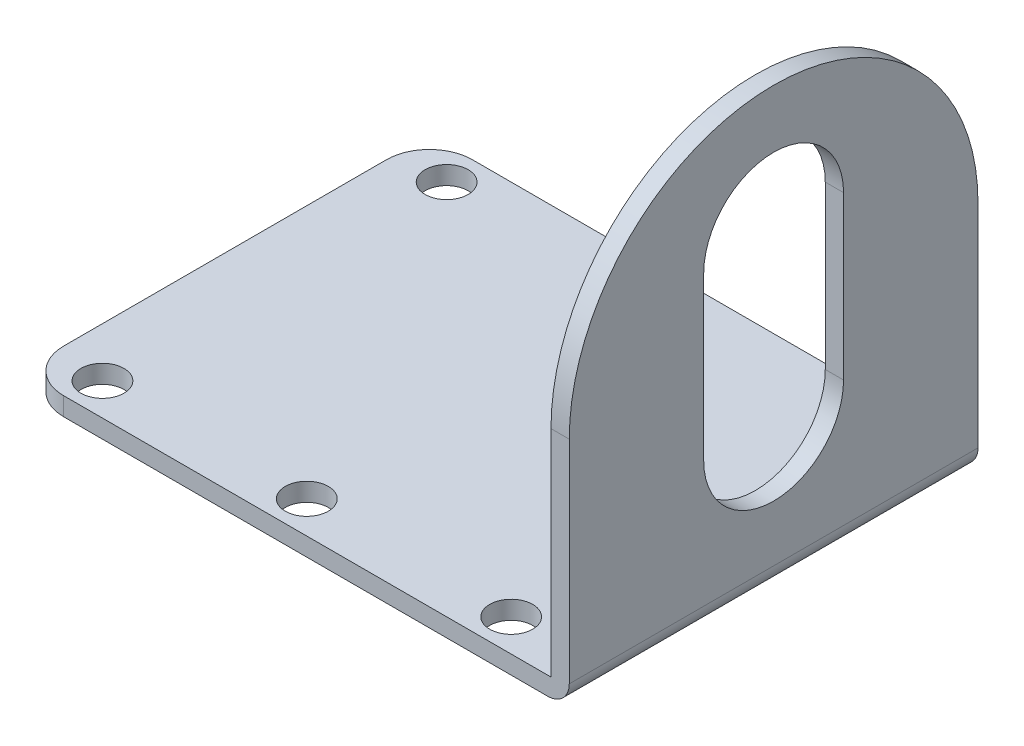
ISO-10303-21;
HEADER;
FILE_DESCRIPTION(('STEP AP214'),'2;1');
FILE_NAME('part.step','',(''),(''),'','','');
FILE_SCHEMA(('AUTOMOTIVE_DESIGN { 1 0 10303 214 1 1 1 1 }'));
ENDSEC;
DATA;
#1=APPLICATION_CONTEXT('core data for automotive mechanical design processes');
#2=APPLICATION_PROTOCOL_DEFINITION('international standard','automotive_design',2000,#1);
#3=PRODUCT_CONTEXT('',#1,'mechanical');
#4=PRODUCT('Part','Part','',(#3));
#5=PRODUCT_RELATED_PRODUCT_CATEGORY('part','',(#4));
#6=PRODUCT_DEFINITION_FORMATION('','',#4);
#7=PRODUCT_DEFINITION_CONTEXT('part definition',#1,'design');
#8=PRODUCT_DEFINITION('design','',#6,#7);
#9=PRODUCT_DEFINITION_SHAPE('','',#8);
#10=(LENGTH_UNIT() NAMED_UNIT(*) SI_UNIT(.MILLI.,.METRE.));
#11=(NAMED_UNIT(*) PLANE_ANGLE_UNIT() SI_UNIT($,.RADIAN.));
#12=(NAMED_UNIT(*) SI_UNIT($,.STERADIAN.) SOLID_ANGLE_UNIT());
#13=UNCERTAINTY_MEASURE_WITH_UNIT(LENGTH_MEASURE(1.E-05),#10,'distance_accuracy_value','');
#14=(GEOMETRIC_REPRESENTATION_CONTEXT(3) GLOBAL_UNCERTAINTY_ASSIGNED_CONTEXT((#13)) GLOBAL_UNIT_ASSIGNED_CONTEXT((#10,
#11,#12)) REPRESENTATION_CONTEXT('',''));
#15=CARTESIAN_POINT('',(0.,0.,0.));
#16=DIRECTION('',(0.,0.,1.));
#17=DIRECTION('',(1.,0.,0.));
#18=AXIS2_PLACEMENT_3D('',#15,#16,#17);
#19=CARTESIAN_POINT('',(-0.3,0.300000000000009,38.));
#20=DIRECTION('',(0.,0.,-1.));
#21=DIRECTION('',(-1.,0.,0.));
#22=AXIS2_PLACEMENT_3D('',#19,#20,#21);
#23=CYLINDRICAL_SURFACE('',#22,2.);
#24=DIRECTION('',(0.,0.,-1.));
#25=VECTOR('',#24,1.);
#26=CARTESIAN_POINT('',(1.7,0.300000000000009,38.));
#27=LINE('',#26,#25);
#28=CARTESIAN_POINT('',(1.7,0.300000000000009,38.));
#29=VERTEX_POINT('',#28);
#30=CARTESIAN_POINT('',(1.7,0.300000000000009,0.));
#31=VERTEX_POINT('',#30);
#32=EDGE_CURVE('E231',#29,#31,#27,.T.);
#33=ORIENTED_EDGE('',*,*,#32,.F.);
#34=CARTESIAN_POINT('',(-0.3,0.300000000000009,38.));
#35=DIRECTION('',(0.,0.,1.));
#36=DIRECTION('',(1.,0.,0.));
#37=AXIS2_PLACEMENT_3D('',#34,#35,#36);
#38=CIRCLE('',#37,2.);
#39=CARTESIAN_POINT('',(-0.3,-1.69999999999999,38.));
#40=VERTEX_POINT('',#39);
#41=EDGE_CURVE('E43',#40,#29,#38,.T.);
#42=ORIENTED_EDGE('',*,*,#41,.F.);
#43=DIRECTION('',(0.,0.,-1.));
#44=VECTOR('',#43,1.);
#45=CARTESIAN_POINT('',(-0.3,-1.69999999999999,38.));
#46=LINE('',#45,#44);
#47=CARTESIAN_POINT('',(-0.3,-1.69999999999999,0.));
#48=VERTEX_POINT('',#47);
#49=EDGE_CURVE('E234',#48,#40,#46,.F.);
#50=ORIENTED_EDGE('',*,*,#49,.F.);
#51=CARTESIAN_POINT('',(-0.3,0.300000000000009,0.));
#52=DIRECTION('',(0.,0.,1.));
#53=DIRECTION('',(1.,0.,0.));
#54=AXIS2_PLACEMENT_3D('',#51,#52,#53);
#55=CIRCLE('',#54,2.);
#56=EDGE_CURVE('E11',#31,#48,#55,.F.);
#57=ORIENTED_EDGE('',*,*,#56,.F.);
#58=EDGE_LOOP('',(#33,#42,#50,#57));
#59=FACE_BOUND('',#58,.T.);
#60=ADVANCED_FACE('F36',(#59),#23,.T.);
#61=CARTESIAN_POINT('',(1.7,20.,19.));
#62=DIRECTION('',(-1.,0.,0.));
#63=DIRECTION('',(0.,0.,1.));
#64=AXIS2_PLACEMENT_3D('',#61,#62,#63);
#65=CYLINDRICAL_SURFACE('',#64,19.);
#66=DIRECTION('',(1.,0.,0.));
#67=VECTOR('',#66,1.);
#68=CARTESIAN_POINT('',(1.7,20.,38.));
#69=LINE('',#68,#67);
#70=CARTESIAN_POINT('',(1.7,20.,38.));
#71=VERTEX_POINT('',#70);
#72=CARTESIAN_POINT('',(0.,20.,38.));
#73=VERTEX_POINT('',#72);
#74=EDGE_CURVE('E211',#71,#73,#69,.F.);
#75=ORIENTED_EDGE('',*,*,#74,.F.);
#76=CARTESIAN_POINT('',(1.7,20.,19.));
#77=DIRECTION('',(-1.,0.,0.));
#78=DIRECTION('',(0.,-1.,0.));
#79=AXIS2_PLACEMENT_3D('',#76,#77,#78);
#80=CIRCLE('',#79,19.);
#81=CARTESIAN_POINT('',(1.7,20.,0.));
#82=VERTEX_POINT('',#81);
#83=EDGE_CURVE('E217',#82,#71,#80,.F.);
#84=ORIENTED_EDGE('',*,*,#83,.F.);
#85=DIRECTION('',(-1.,0.,0.));
#86=VECTOR('',#85,1.);
#87=CARTESIAN_POINT('',(0.,20.,0.));
#88=LINE('',#87,#86);
#89=CARTESIAN_POINT('',(0.,20.,0.));
#90=VERTEX_POINT('',#89);
#91=EDGE_CURVE('E214',#90,#82,#88,.F.);
#92=ORIENTED_EDGE('',*,*,#91,.F.);
#93=CARTESIAN_POINT('',(0.,20.,19.));
#94=DIRECTION('',(1.,0.,0.));
#95=DIRECTION('',(0.,1.,0.));
#96=AXIS2_PLACEMENT_3D('',#93,#94,#95);
#97=CIRCLE('',#96,19.);
#98=EDGE_CURVE('E220',#73,#90,#97,.F.);
#99=ORIENTED_EDGE('',*,*,#98,.F.);
#100=EDGE_LOOP('',(#75,#84,#92,#99));
#101=FACE_BOUND('',#100,.T.);
#102=ADVANCED_FACE('F243',(#101),#65,.T.);
#103=CARTESIAN_POINT('',(-45.3,0.,34.));
#104=DIRECTION('',(0.,1.,0.));
#105=DIRECTION('',(0.,0.,1.));
#106=AXIS2_PLACEMENT_3D('',#103,#104,#105);
#107=CYLINDRICAL_SURFACE('',#106,4.);
#108=DIRECTION('',(0.,-1.,0.));
#109=VECTOR('',#108,1.);
#110=CARTESIAN_POINT('',(-45.3,0.,38.));
#111=LINE('',#110,#109);
#112=CARTESIAN_POINT('',(-45.3,0.,38.));
#113=VERTEX_POINT('',#112);
#114=CARTESIAN_POINT('',(-45.3,-1.7,38.));
#115=VERTEX_POINT('',#114);
#116=EDGE_CURVE('E201',#113,#115,#111,.T.);
#117=ORIENTED_EDGE('',*,*,#116,.F.);
#118=CARTESIAN_POINT('',(-45.3,0.,34.));
#119=DIRECTION('',(0.,-1.,0.));
#120=DIRECTION('',(0.,0.,-1.));
#121=AXIS2_PLACEMENT_3D('',#118,#119,#120);
#122=CIRCLE('',#121,4.);
#123=CARTESIAN_POINT('',(-49.3,0.,34.));
#124=VERTEX_POINT('',#123);
#125=EDGE_CURVE('E207',#124,#113,#122,.F.);
#126=ORIENTED_EDGE('',*,*,#125,.F.);
#127=DIRECTION('',(0.,-1.,0.));
#128=VECTOR('',#127,1.);
#129=CARTESIAN_POINT('',(-49.3,0.,34.));
#130=LINE('',#129,#128);
#131=CARTESIAN_POINT('',(-49.3,-1.7,34.));
#132=VERTEX_POINT('',#131);
#133=EDGE_CURVE('E204',#132,#124,#130,.F.);
#134=ORIENTED_EDGE('',*,*,#133,.F.);
#135=CARTESIAN_POINT('',(-45.3,-1.7,34.));
#136=DIRECTION('',(0.,1.,0.));
#137=DIRECTION('',(-1.,0.,0.));
#138=AXIS2_PLACEMENT_3D('',#135,#136,#137);
#139=CIRCLE('',#138,4.);
#140=EDGE_CURVE('E209',#115,#132,#139,.F.);
#141=ORIENTED_EDGE('',*,*,#140,.F.);
#142=EDGE_LOOP('',(#117,#126,#134,#141));
#143=FACE_BOUND('',#142,.T.);
#144=ADVANCED_FACE('F268',(#143),#107,.T.);
#145=CARTESIAN_POINT('',(-45.3,0.,4.));
#146=DIRECTION('',(0.,1.,0.));
#147=DIRECTION('',(0.,0.,1.));
#148=AXIS2_PLACEMENT_3D('',#145,#146,#147);
#149=CYLINDRICAL_SURFACE('',#148,4.);
#150=DIRECTION('',(0.,1.,0.));
#151=VECTOR('',#150,1.);
#152=CARTESIAN_POINT('',(-45.3,0.,0.));
#153=LINE('',#152,#151);
#154=CARTESIAN_POINT('',(-45.3,-1.7,0.));
#155=VERTEX_POINT('',#154);
#156=CARTESIAN_POINT('',(-45.3,0.,0.));
#157=VERTEX_POINT('',#156);
#158=EDGE_CURVE('E190',#155,#157,#153,.T.);
#159=ORIENTED_EDGE('',*,*,#158,.F.);
#160=CARTESIAN_POINT('',(-45.3,-1.7,4.));
#161=DIRECTION('',(0.,1.,0.));
#162=DIRECTION('',(-1.,0.,0.));
#163=AXIS2_PLACEMENT_3D('',#160,#161,#162);
#164=CIRCLE('',#163,4.);
#165=CARTESIAN_POINT('',(-49.3,-1.7,4.));
#166=VERTEX_POINT('',#165);
#167=EDGE_CURVE('E196',#166,#155,#164,.F.);
#168=ORIENTED_EDGE('',*,*,#167,.F.);
#169=DIRECTION('',(0.,1.,0.));
#170=VECTOR('',#169,1.);
#171=CARTESIAN_POINT('',(-49.3,-1.7,4.));
#172=LINE('',#171,#170);
#173=CARTESIAN_POINT('',(-49.3,0.,4.));
#174=VERTEX_POINT('',#173);
#175=EDGE_CURVE('E193',#174,#166,#172,.F.);
#176=ORIENTED_EDGE('',*,*,#175,.F.);
#177=CARTESIAN_POINT('',(-45.3,0.,4.));
#178=DIRECTION('',(0.,-1.,0.));
#179=DIRECTION('',(0.,0.,-1.));
#180=AXIS2_PLACEMENT_3D('',#177,#178,#179);
#181=CIRCLE('',#180,4.);
#182=EDGE_CURVE('E198',#157,#174,#181,.F.);
#183=ORIENTED_EDGE('',*,*,#182,.F.);
#184=EDGE_LOOP('',(#159,#168,#176,#183));
#185=FACE_BOUND('',#184,.T.);
#186=ADVANCED_FACE('F264',(#185),#149,.T.);
#187=CARTESIAN_POINT('',(-49.3,0.,38.));
#188=DIRECTION('',(0.,-1.,0.));
#189=DIRECTION('',(0.,0.,-1.));
#190=AXIS2_PLACEMENT_3D('',#187,#188,#189);
#191=PLANE('',#190);
#192=CARTESIAN_POINT('',(-44.7,0.,35.));
#193=DIRECTION('',(0.,-1.,0.));
#194=DIRECTION('',(0.,0.,-1.));
#195=AXIS2_PLACEMENT_3D('',#192,#193,#194);
#196=CIRCLE('',#195,2.00000000000001);
#197=CARTESIAN_POINT('',(-44.7,0.,33.));
#198=VERTEX_POINT('',#197);
#199=EDGE_CURVE('E498',#198,#198,#196,.T.);
#200=ORIENTED_EDGE('',*,*,#199,.T.);
#201=EDGE_LOOP('',(#200));
#202=FACE_BOUND('',#201,.T.);
#203=CARTESIAN_POINT('',(-25.7,0.,35.));
#204=DIRECTION('',(0.,-1.,0.));
#205=DIRECTION('',(0.,0.,-1.));
#206=AXIS2_PLACEMENT_3D('',#203,#204,#205);
#207=CIRCLE('',#206,2.);
#208=CARTESIAN_POINT('',(-25.7,0.,33.));
#209=VERTEX_POINT('',#208);
#210=EDGE_CURVE('E495',#209,#209,#207,.T.);
#211=ORIENTED_EDGE('',*,*,#210,.T.);
#212=EDGE_LOOP('',(#211));
#213=FACE_BOUND('',#212,.T.);
#214=CARTESIAN_POINT('',(-6.7,0.,35.));
#215=DIRECTION('',(0.,-1.,0.));
#216=DIRECTION('',(0.,0.,-1.));
#217=AXIS2_PLACEMENT_3D('',#214,#215,#216);
#218=CIRCLE('',#217,2.);
#219=CARTESIAN_POINT('',(-6.7,0.,33.));
#220=VERTEX_POINT('',#219);
#221=EDGE_CURVE('E492',#220,#220,#218,.T.);
#222=ORIENTED_EDGE('',*,*,#221,.T.);
#223=EDGE_LOOP('',(#222));
#224=FACE_BOUND('',#223,.T.);
#225=CARTESIAN_POINT('',(-6.7,0.,3.));
#226=DIRECTION('',(0.,-1.,0.));
#227=DIRECTION('',(0.,0.,-1.));
#228=AXIS2_PLACEMENT_3D('',#225,#226,#227);
#229=CIRCLE('',#228,2.);
#230=CARTESIAN_POINT('',(-6.7,0.,0.999999999999999));
#231=VERTEX_POINT('',#230);
#232=EDGE_CURVE('E489',#231,#231,#229,.T.);
#233=ORIENTED_EDGE('',*,*,#232,.T.);
#234=EDGE_LOOP('',(#233));
#235=FACE_BOUND('',#234,.T.);
#236=CARTESIAN_POINT('',(-25.7,0.,3.));
#237=DIRECTION('',(0.,-1.,0.));
#238=DIRECTION('',(0.,0.,-1.));
#239=AXIS2_PLACEMENT_3D('',#236,#237,#238);
#240=CIRCLE('',#239,2.);
#241=CARTESIAN_POINT('',(-25.7,0.,1.));
#242=VERTEX_POINT('',#241);
#243=EDGE_CURVE('E481',#242,#242,#240,.T.);
#244=ORIENTED_EDGE('',*,*,#243,.T.);
#245=EDGE_LOOP('',(#244));
#246=FACE_BOUND('',#245,.T.);
#247=CARTESIAN_POINT('',(-44.7,0.,3.));
#248=DIRECTION('',(0.,-1.,0.));
#249=DIRECTION('',(0.,0.,-1.));
#250=AXIS2_PLACEMENT_3D('',#247,#248,#249);
#251=CIRCLE('',#250,2.);
#252=CARTESIAN_POINT('',(-44.7,0.,0.999999999999996));
#253=VERTEX_POINT('',#252);
#254=EDGE_CURVE('E478',#253,#253,#251,.T.);
#255=ORIENTED_EDGE('',*,*,#254,.T.);
#256=EDGE_LOOP('',(#255));
#257=FACE_BOUND('',#256,.T.);
#258=DIRECTION('',(0.,0.,-1.));
#259=VECTOR('',#258,1.);
#260=CARTESIAN_POINT('',(-49.3,0.,38.));
#261=LINE('',#260,#259);
#262=EDGE_CURVE('E188',#124,#174,#261,.T.);
#263=ORIENTED_EDGE('',*,*,#262,.F.);
#264=ORIENTED_EDGE('',*,*,#125,.T.);
#265=DIRECTION('',(-1.,0.,0.));
#266=VECTOR('',#265,1.);
#267=CARTESIAN_POINT('',(-49.3,0.,38.));
#268=LINE('',#267,#266);
#269=CARTESIAN_POINT('',(0.,0.,38.));
#270=VERTEX_POINT('',#269);
#271=EDGE_CURVE('E164',#270,#113,#268,.T.);
#272=ORIENTED_EDGE('',*,*,#271,.F.);
#273=DIRECTION('',(0.,0.,-1.));
#274=VECTOR('',#273,1.);
#275=CARTESIAN_POINT('',(0.,0.,38.));
#276=LINE('',#275,#274);
#277=CARTESIAN_POINT('',(0.,0.,0.));
#278=VERTEX_POINT('',#277);
#279=EDGE_CURVE('E175',#270,#278,#276,.T.);
#280=ORIENTED_EDGE('',*,*,#279,.T.);
#281=DIRECTION('',(-1.,0.,0.));
#282=VECTOR('',#281,1.);
#283=CARTESIAN_POINT('',(-49.3,0.,0.));
#284=LINE('',#283,#282);
#285=EDGE_CURVE('E161',#278,#157,#284,.T.);
#286=ORIENTED_EDGE('',*,*,#285,.T.);
#287=ORIENTED_EDGE('',*,*,#182,.T.);
#288=EDGE_LOOP('',(#263,#264,#272,#280,#286,#287));
#289=FACE_BOUND('',#288,.T.);
#290=ADVANCED_FACE('F253',(#202,#213,#224,#235,#246,#257,#289),#191,.F.);
#291=CARTESIAN_POINT('',(-49.3,-1.7,38.));
#292=DIRECTION('',(1.,0.,0.));
#293=DIRECTION('',(0.,0.,-1.));
#294=AXIS2_PLACEMENT_3D('',#291,#292,#293);
#295=PLANE('',#294);
#296=DIRECTION('',(0.,0.,-1.));
#297=VECTOR('',#296,1.);
#298=CARTESIAN_POINT('',(-49.3,-1.7,38.));
#299=LINE('',#298,#297);
#300=EDGE_CURVE('E186',#132,#166,#299,.T.);
#301=ORIENTED_EDGE('',*,*,#300,.F.);
#302=ORIENTED_EDGE('',*,*,#133,.T.);
#303=ORIENTED_EDGE('',*,*,#262,.T.);
#304=ORIENTED_EDGE('',*,*,#175,.T.);
#305=EDGE_LOOP('',(#301,#302,#303,#304));
#306=FACE_BOUND('',#305,.T.);
#307=ADVANCED_FACE('F267',(#306),#295,.F.);
#308=CARTESIAN_POINT('',(1.7,-1.69999999999999,38.));
#309=DIRECTION('',(0.,1.,0.));
#310=DIRECTION('',(-1.,0.,0.));
#311=AXIS2_PLACEMENT_3D('',#308,#309,#310);
#312=PLANE('',#311);
#313=CARTESIAN_POINT('',(-44.7,-1.7,35.));
#314=DIRECTION('',(0.,-1.,0.));
#315=DIRECTION('',(-1.,0.,0.));
#316=AXIS2_PLACEMENT_3D('',#313,#314,#315);
#317=CIRCLE('',#316,2.00000000000001);
#318=CARTESIAN_POINT('',(-46.7,-1.7,35.));
#319=VERTEX_POINT('',#318);
#320=EDGE_CURVE('E458',#319,#319,#317,.T.);
#321=ORIENTED_EDGE('',*,*,#320,.F.);
#322=EDGE_LOOP('',(#321));
#323=FACE_BOUND('',#322,.T.);
#324=CARTESIAN_POINT('',(-25.7,-1.7,35.));
#325=DIRECTION('',(0.,-1.,0.));
#326=DIRECTION('',(-1.,0.,0.));
#327=AXIS2_PLACEMENT_3D('',#324,#325,#326);
#328=CIRCLE('',#327,2.);
#329=CARTESIAN_POINT('',(-27.7,-1.7,35.));
#330=VERTEX_POINT('',#329);
#331=EDGE_CURVE('E462',#330,#330,#328,.T.);
#332=ORIENTED_EDGE('',*,*,#331,.F.);
#333=EDGE_LOOP('',(#332));
#334=FACE_BOUND('',#333,.T.);
#335=CARTESIAN_POINT('',(-6.7,-1.69999999999999,35.));
#336=DIRECTION('',(0.,-1.,0.));
#337=DIRECTION('',(-1.,0.,0.));
#338=AXIS2_PLACEMENT_3D('',#335,#336,#337);
#339=CIRCLE('',#338,2.);
#340=CARTESIAN_POINT('',(-8.7,-1.69999999999999,35.));
#341=VERTEX_POINT('',#340);
#342=EDGE_CURVE('E466',#341,#341,#339,.T.);
#343=ORIENTED_EDGE('',*,*,#342,.F.);
#344=EDGE_LOOP('',(#343));
#345=FACE_BOUND('',#344,.T.);
#346=CARTESIAN_POINT('',(-6.7,-1.69999999999999,3.));
#347=DIRECTION('',(0.,-1.,0.));
#348=DIRECTION('',(1.,0.,0.));
#349=AXIS2_PLACEMENT_3D('',#346,#347,#348);
#350=CIRCLE('',#349,2.);
#351=CARTESIAN_POINT('',(-4.7,-1.69999999999999,3.));
#352=VERTEX_POINT('',#351);
#353=EDGE_CURVE('E470',#352,#352,#350,.T.);
#354=ORIENTED_EDGE('',*,*,#353,.F.);
#355=EDGE_LOOP('',(#354));
#356=FACE_BOUND('',#355,.T.);
#357=CARTESIAN_POINT('',(-25.7,-1.7,3.));
#358=DIRECTION('',(0.,-1.,0.));
#359=DIRECTION('',(1.,0.,0.));
#360=AXIS2_PLACEMENT_3D('',#357,#358,#359);
#361=CIRCLE('',#360,2.);
#362=CARTESIAN_POINT('',(-23.7,-1.7,3.));
#363=VERTEX_POINT('',#362);
#364=EDGE_CURVE('E474',#363,#363,#361,.T.);
#365=ORIENTED_EDGE('',*,*,#364,.F.);
#366=EDGE_LOOP('',(#365));
#367=FACE_BOUND('',#366,.T.);
#368=CARTESIAN_POINT('',(-44.7,-1.7,3.));
#369=DIRECTION('',(0.,-1.,0.));
#370=DIRECTION('',(1.,0.,0.));
#371=AXIS2_PLACEMENT_3D('',#368,#369,#370);
#372=CIRCLE('',#371,2.);
#373=CARTESIAN_POINT('',(-42.7,-1.7,3.));
#374=VERTEX_POINT('',#373);
#375=EDGE_CURVE('E477',#374,#374,#372,.T.);
#376=ORIENTED_EDGE('',*,*,#375,.F.);
#377=EDGE_LOOP('',(#376));
#378=FACE_BOUND('',#377,.T.);
#379=DIRECTION('',(1.,0.,0.));
#380=VECTOR('',#379,1.);
#381=CARTESIAN_POINT('',(1.7,-1.69999999999999,0.));
#382=LINE('',#381,#380);
#383=EDGE_CURVE('E178',#155,#48,#382,.T.);
#384=ORIENTED_EDGE('',*,*,#383,.T.);
#385=ORIENTED_EDGE('',*,*,#49,.T.);
#386=DIRECTION('',(1.,0.,0.));
#387=VECTOR('',#386,1.);
#388=CARTESIAN_POINT('',(1.7,-1.69999999999999,38.));
#389=LINE('',#388,#387);
#390=EDGE_CURVE('E167',#115,#40,#389,.T.);
#391=ORIENTED_EDGE('',*,*,#390,.F.);
#392=ORIENTED_EDGE('',*,*,#140,.T.);
#393=ORIENTED_EDGE('',*,*,#300,.T.);
#394=ORIENTED_EDGE('',*,*,#167,.T.);
#395=EDGE_LOOP('',(#384,#385,#391,#392,#393,#394));
#396=FACE_BOUND('',#395,.T.);
#397=ADVANCED_FACE('F257',(#323,#334,#345,#356,#367,#378,#396),#312,.F.);
#398=CARTESIAN_POINT('',(1.7,39.,38.));
#399=DIRECTION('',(-1.,0.,0.));
#400=DIRECTION('',(0.,-1.,0.));
#401=AXIS2_PLACEMENT_3D('',#398,#399,#400);
#402=PLANE('',#401);
#403=DIRECTION('',(0.,1.,0.));
#404=VECTOR('',#403,1.);
#405=CARTESIAN_POINT('',(1.7,12.0139179360416,12.5));
#406=LINE('',#405,#404);
#407=CARTESIAN_POINT('',(1.7,12.0139179360416,12.5));
#408=VERTEX_POINT('',#407);
#409=CARTESIAN_POINT('',(1.7,27.1,12.5));
#410=VERTEX_POINT('',#409);
#411=EDGE_CURVE('E144',#408,#410,#406,.T.);
#412=ORIENTED_EDGE('',*,*,#411,.F.);
#413=CARTESIAN_POINT('',(1.7,12.0139179360416,19.));
#414=DIRECTION('',(1.,0.,0.));
#415=DIRECTION('',(0.,1.,0.));
#416=AXIS2_PLACEMENT_3D('',#413,#414,#415);
#417=CIRCLE('',#416,6.5);
#418=CARTESIAN_POINT('',(1.7,12.0139179360416,25.5));
#419=VERTEX_POINT('',#418);
#420=EDGE_CURVE('E149',#419,#408,#417,.T.);
#421=ORIENTED_EDGE('',*,*,#420,.F.);
#422=DIRECTION('',(0.,-1.,0.));
#423=VECTOR('',#422,1.);
#424=CARTESIAN_POINT('',(1.7,12.0139179360416,25.5));
#425=LINE('',#424,#423);
#426=CARTESIAN_POINT('',(1.7,27.1,25.5));
#427=VERTEX_POINT('',#426);
#428=EDGE_CURVE('E154',#427,#419,#425,.T.);
#429=ORIENTED_EDGE('',*,*,#428,.F.);
#430=CARTESIAN_POINT('',(1.7,27.1,19.));
#431=DIRECTION('',(1.,0.,0.));
#432=DIRECTION('',(0.,1.,0.));
#433=AXIS2_PLACEMENT_3D('',#430,#431,#432);
#434=CIRCLE('',#433,6.5);
#435=EDGE_CURVE('E133',#410,#427,#434,.T.);
#436=ORIENTED_EDGE('',*,*,#435,.F.);
#437=EDGE_LOOP('',(#412,#421,#429,#436));
#438=FACE_BOUND('',#437,.T.);
#439=DIRECTION('',(0.,1.,0.));
#440=VECTOR('',#439,1.);
#441=CARTESIAN_POINT('',(1.7,39.,38.));
#442=LINE('',#441,#440);
#443=EDGE_CURVE('E171',#29,#71,#442,.T.);
#444=ORIENTED_EDGE('',*,*,#443,.F.);
#445=ORIENTED_EDGE('',*,*,#32,.T.);
#446=DIRECTION('',(0.,1.,0.));
#447=VECTOR('',#446,1.);
#448=CARTESIAN_POINT('',(1.7,39.,0.));
#449=LINE('',#448,#447);
#450=EDGE_CURVE('E181',#31,#82,#449,.T.);
#451=ORIENTED_EDGE('',*,*,#450,.T.);
#452=ORIENTED_EDGE('',*,*,#83,.T.);
#453=EDGE_LOOP('',(#444,#445,#451,#452));
#454=FACE_BOUND('',#453,.T.);
#455=ADVANCED_FACE('F151',(#438,#454),#402,.F.);
#456=CARTESIAN_POINT('',(0.,0.,38.));
#457=DIRECTION('',(1.,0.,0.));
#458=DIRECTION('',(0.,1.,0.));
#459=AXIS2_PLACEMENT_3D('',#456,#457,#458);
#460=PLANE('',#459);
#461=DIRECTION('',(0.,-1.,0.));
#462=VECTOR('',#461,1.);
#463=CARTESIAN_POINT('',(0.,0.,25.5));
#464=LINE('',#463,#462);
#465=CARTESIAN_POINT('',(0.,27.1,25.5));
#466=VERTEX_POINT('',#465);
#467=CARTESIAN_POINT('',(0.,12.0139179360416,25.5));
#468=VERTEX_POINT('',#467);
#469=EDGE_CURVE('E225',#466,#468,#464,.T.);
#470=ORIENTED_EDGE('',*,*,#469,.T.);
#471=CARTESIAN_POINT('',(0.,12.0139179360416,19.));
#472=DIRECTION('',(1.,0.,0.));
#473=DIRECTION('',(0.,1.,0.));
#474=AXIS2_PLACEMENT_3D('',#471,#472,#473);
#475=CIRCLE('',#474,6.5);
#476=CARTESIAN_POINT('',(0.,12.0139179360416,12.5));
#477=VERTEX_POINT('',#476);
#478=EDGE_CURVE('E228',#468,#477,#475,.T.);
#479=ORIENTED_EDGE('',*,*,#478,.T.);
#480=DIRECTION('',(0.,1.,0.));
#481=VECTOR('',#480,1.);
#482=CARTESIAN_POINT('',(0.,0.,12.5));
#483=LINE('',#482,#481);
#484=CARTESIAN_POINT('',(0.,27.1,12.5));
#485=VERTEX_POINT('',#484);
#486=EDGE_CURVE('E222',#477,#485,#483,.T.);
#487=ORIENTED_EDGE('',*,*,#486,.T.);
#488=CARTESIAN_POINT('',(0.,27.1,19.));
#489=DIRECTION('',(1.,0.,0.));
#490=DIRECTION('',(0.,1.,0.));
#491=AXIS2_PLACEMENT_3D('',#488,#489,#490);
#492=CIRCLE('',#491,6.5);
#493=EDGE_CURVE('E136',#485,#466,#492,.T.);
#494=ORIENTED_EDGE('',*,*,#493,.T.);
#495=EDGE_LOOP('',(#470,#479,#487,#494));
#496=FACE_BOUND('',#495,.T.);
#497=DIRECTION('',(0.,-1.,0.));
#498=VECTOR('',#497,1.);
#499=CARTESIAN_POINT('',(0.,0.,38.));
#500=LINE('',#499,#498);
#501=EDGE_CURVE('E173',#73,#270,#500,.T.);
#502=ORIENTED_EDGE('',*,*,#501,.F.);
#503=ORIENTED_EDGE('',*,*,#98,.T.);
#504=DIRECTION('',(0.,-1.,0.));
#505=VECTOR('',#504,1.);
#506=CARTESIAN_POINT('',(0.,0.,0.));
#507=LINE('',#506,#505);
#508=EDGE_CURVE('E168',#90,#278,#507,.T.);
#509=ORIENTED_EDGE('',*,*,#508,.T.);
#510=ORIENTED_EDGE('',*,*,#279,.F.);
#511=EDGE_LOOP('',(#502,#503,#509,#510));
#512=FACE_BOUND('',#511,.T.);
#513=ADVANCED_FACE('F247',(#496,#512),#460,.F.);
#514=CARTESIAN_POINT('',(0.,0.,38.));
#515=DIRECTION('',(0.,0.,1.));
#516=DIRECTION('',(1.,0.,0.));
#517=AXIS2_PLACEMENT_3D('',#514,#515,#516);
#518=PLANE('',#517);
#519=ORIENTED_EDGE('',*,*,#390,.T.);
#520=ORIENTED_EDGE('',*,*,#41,.T.);
#521=ORIENTED_EDGE('',*,*,#443,.T.);
#522=ORIENTED_EDGE('',*,*,#74,.T.);
#523=ORIENTED_EDGE('',*,*,#501,.T.);
#524=ORIENTED_EDGE('',*,*,#271,.T.);
#525=ORIENTED_EDGE('',*,*,#116,.T.);
#526=EDGE_LOOP('',(#519,#520,#521,#522,#523,#524,#525));
#527=FACE_BOUND('',#526,.T.);
#528=ADVANCED_FACE('F236',(#527),#518,.T.);
#529=CARTESIAN_POINT('',(0.,0.,0.));
#530=DIRECTION('',(0.,0.,1.));
#531=DIRECTION('',(1.,0.,0.));
#532=AXIS2_PLACEMENT_3D('',#529,#530,#531);
#533=PLANE('',#532);
#534=ORIENTED_EDGE('',*,*,#450,.F.);
#535=ORIENTED_EDGE('',*,*,#56,.T.);
#536=ORIENTED_EDGE('',*,*,#383,.F.);
#537=ORIENTED_EDGE('',*,*,#158,.T.);
#538=ORIENTED_EDGE('',*,*,#285,.F.);
#539=ORIENTED_EDGE('',*,*,#508,.F.);
#540=ORIENTED_EDGE('',*,*,#91,.T.);
#541=EDGE_LOOP('',(#534,#535,#536,#537,#538,#539,#540));
#542=FACE_BOUND('',#541,.T.);
#543=ADVANCED_FACE('F261',(#542),#533,.F.);
#544=CARTESIAN_POINT('',(-36.3,12.0139179360416,19.));
#545=DIRECTION('',(1.,0.,0.));
#546=DIRECTION('',(0.,1.,0.));
#547=AXIS2_PLACEMENT_3D('',#544,#545,#546);
#548=CYLINDRICAL_SURFACE('',#547,6.5);
#549=DIRECTION('',(1.,0.,0.));
#550=VECTOR('',#549,1.);
#551=CARTESIAN_POINT('',(-36.3,12.0139179360416,25.5));
#552=LINE('',#551,#550);
#553=EDGE_CURVE('E159',#468,#419,#552,.T.);
#554=ORIENTED_EDGE('',*,*,#553,.T.);
#555=ORIENTED_EDGE('',*,*,#420,.T.);
#556=DIRECTION('',(1.,0.,0.));
#557=VECTOR('',#556,1.);
#558=CARTESIAN_POINT('',(-36.3,12.0139179360416,12.5));
#559=LINE('',#558,#557);
#560=EDGE_CURVE('E140',#477,#408,#559,.T.);
#561=ORIENTED_EDGE('',*,*,#560,.F.);
#562=ORIENTED_EDGE('',*,*,#478,.F.);
#563=EDGE_LOOP('',(#554,#555,#561,#562));
#564=FACE_BOUND('',#563,.T.);
#565=ADVANCED_FACE('F309',(#564),#548,.F.);
#566=CARTESIAN_POINT('',(-36.3,12.0139179360416,25.5));
#567=DIRECTION('',(0.,0.,1.));
#568=DIRECTION('',(0.,-1.,0.));
#569=AXIS2_PLACEMENT_3D('',#566,#567,#568);
#570=PLANE('',#569);
#571=DIRECTION('',(1.,0.,0.));
#572=VECTOR('',#571,1.);
#573=CARTESIAN_POINT('',(-36.3,27.1,25.5));
#574=LINE('',#573,#572);
#575=EDGE_CURVE('E139',#466,#427,#574,.T.);
#576=ORIENTED_EDGE('',*,*,#575,.T.);
#577=ORIENTED_EDGE('',*,*,#428,.T.);
#578=ORIENTED_EDGE('',*,*,#553,.F.);
#579=ORIENTED_EDGE('',*,*,#469,.F.);
#580=EDGE_LOOP('',(#576,#577,#578,#579));
#581=FACE_BOUND('',#580,.T.);
#582=ADVANCED_FACE('F313',(#581),#570,.F.);
#583=CARTESIAN_POINT('',(-36.3,27.1,19.));
#584=DIRECTION('',(1.,0.,0.));
#585=DIRECTION('',(0.,1.,0.));
#586=AXIS2_PLACEMENT_3D('',#583,#584,#585);
#587=CYLINDRICAL_SURFACE('',#586,6.5);
#588=DIRECTION('',(1.,0.,0.));
#589=VECTOR('',#588,1.);
#590=CARTESIAN_POINT('',(-36.3,27.1,12.5));
#591=LINE('',#590,#589);
#592=EDGE_CURVE('E128',#485,#410,#591,.T.);
#593=ORIENTED_EDGE('',*,*,#592,.T.);
#594=ORIENTED_EDGE('',*,*,#435,.T.);
#595=ORIENTED_EDGE('',*,*,#575,.F.);
#596=ORIENTED_EDGE('',*,*,#493,.F.);
#597=EDGE_LOOP('',(#593,#594,#595,#596));
#598=FACE_BOUND('',#597,.T.);
#599=ADVANCED_FACE('F130',(#598),#587,.F.);
#600=CARTESIAN_POINT('',(-36.3,12.0139179360416,12.5));
#601=DIRECTION('',(0.,0.,-1.));
#602=DIRECTION('',(0.,1.,0.));
#603=AXIS2_PLACEMENT_3D('',#600,#601,#602);
#604=PLANE('',#603);
#605=ORIENTED_EDGE('',*,*,#560,.T.);
#606=ORIENTED_EDGE('',*,*,#411,.T.);
#607=ORIENTED_EDGE('',*,*,#592,.F.);
#608=ORIENTED_EDGE('',*,*,#486,.F.);
#609=EDGE_LOOP('',(#605,#606,#607,#608));
#610=FACE_BOUND('',#609,.T.);
#611=ADVANCED_FACE('F145',(#610),#604,.F.);
#612=CARTESIAN_POINT('',(-44.7,36.3,3.));
#613=DIRECTION('',(0.,-1.,0.));
#614=DIRECTION('',(1.,0.,0.));
#615=AXIS2_PLACEMENT_3D('',#612,#613,#614);
#616=CYLINDRICAL_SURFACE('',#615,2.);
#617=ORIENTED_EDGE('',*,*,#375,.T.);
#618=EDGE_LOOP('',(#617));
#619=FACE_BOUND('',#618,.T.);
#620=ORIENTED_EDGE('',*,*,#254,.F.);
#621=EDGE_LOOP('',(#620));
#622=FACE_BOUND('',#621,.T.);
#623=ADVANCED_FACE('F341',(#619,#622),#616,.F.);
#624=CARTESIAN_POINT('',(-25.7,36.3,3.));
#625=DIRECTION('',(0.,-1.,0.));
#626=DIRECTION('',(1.,0.,0.));
#627=AXIS2_PLACEMENT_3D('',#624,#625,#626);
#628=CYLINDRICAL_SURFACE('',#627,2.);
#629=ORIENTED_EDGE('',*,*,#364,.T.);
#630=EDGE_LOOP('',(#629));
#631=FACE_BOUND('',#630,.T.);
#632=ORIENTED_EDGE('',*,*,#243,.F.);
#633=EDGE_LOOP('',(#632));
#634=FACE_BOUND('',#633,.T.);
#635=ADVANCED_FACE('F359',(#631,#634),#628,.F.);
#636=CARTESIAN_POINT('',(-6.7,36.3,3.));
#637=DIRECTION('',(0.,-1.,0.));
#638=DIRECTION('',(1.,0.,0.));
#639=AXIS2_PLACEMENT_3D('',#636,#637,#638);
#640=CYLINDRICAL_SURFACE('',#639,2.);
#641=ORIENTED_EDGE('',*,*,#353,.T.);
#642=EDGE_LOOP('',(#641));
#643=FACE_BOUND('',#642,.T.);
#644=ORIENTED_EDGE('',*,*,#232,.F.);
#645=EDGE_LOOP('',(#644));
#646=FACE_BOUND('',#645,.T.);
#647=ADVANCED_FACE('F369',(#643,#646),#640,.F.);
#648=CARTESIAN_POINT('',(-6.7,36.3,35.));
#649=DIRECTION('',(0.,-1.,0.));
#650=DIRECTION('',(1.,0.,0.));
#651=AXIS2_PLACEMENT_3D('',#648,#649,#650);
#652=CYLINDRICAL_SURFACE('',#651,2.);
#653=ORIENTED_EDGE('',*,*,#342,.T.);
#654=EDGE_LOOP('',(#653));
#655=FACE_BOUND('',#654,.T.);
#656=ORIENTED_EDGE('',*,*,#221,.F.);
#657=EDGE_LOOP('',(#656));
#658=FACE_BOUND('',#657,.T.);
#659=ADVANCED_FACE('F379',(#655,#658),#652,.F.);
#660=CARTESIAN_POINT('',(-25.7,36.3,35.));
#661=DIRECTION('',(0.,-1.,0.));
#662=DIRECTION('',(1.,0.,0.));
#663=AXIS2_PLACEMENT_3D('',#660,#661,#662);
#664=CYLINDRICAL_SURFACE('',#663,2.);
#665=ORIENTED_EDGE('',*,*,#331,.T.);
#666=EDGE_LOOP('',(#665));
#667=FACE_BOUND('',#666,.T.);
#668=ORIENTED_EDGE('',*,*,#210,.F.);
#669=EDGE_LOOP('',(#668));
#670=FACE_BOUND('',#669,.T.);
#671=ADVANCED_FACE('F389',(#667,#670),#664,.F.);
#672=CARTESIAN_POINT('',(-44.7,36.3,35.));
#673=DIRECTION('',(0.,-1.,0.));
#674=DIRECTION('',(1.,0.,0.));
#675=AXIS2_PLACEMENT_3D('',#672,#673,#674);
#676=CYLINDRICAL_SURFACE('',#675,2.00000000000001);
#677=ORIENTED_EDGE('',*,*,#320,.T.);
#678=EDGE_LOOP('',(#677));
#679=FACE_BOUND('',#678,.T.);
#680=ORIENTED_EDGE('',*,*,#199,.F.);
#681=EDGE_LOOP('',(#680));
#682=FACE_BOUND('',#681,.T.);
#683=ADVANCED_FACE('F398',(#679,#682),#676,.F.);
#684=CLOSED_SHELL('',(#60,#102,#144,#186,#290,#307,#397,#455,#513,#528,#543,#565,#582,#599,#611,
#623,#635,#647,#659,#671,#683));
#685=MANIFOLD_SOLID_BREP('B2',#684);
#686=ADVANCED_BREP_SHAPE_REPRESENTATION('',(#18,#685),#14);
#687=SHAPE_DEFINITION_REPRESENTATION(#9,#686);
ENDSEC;
END-ISO-10303-21;
